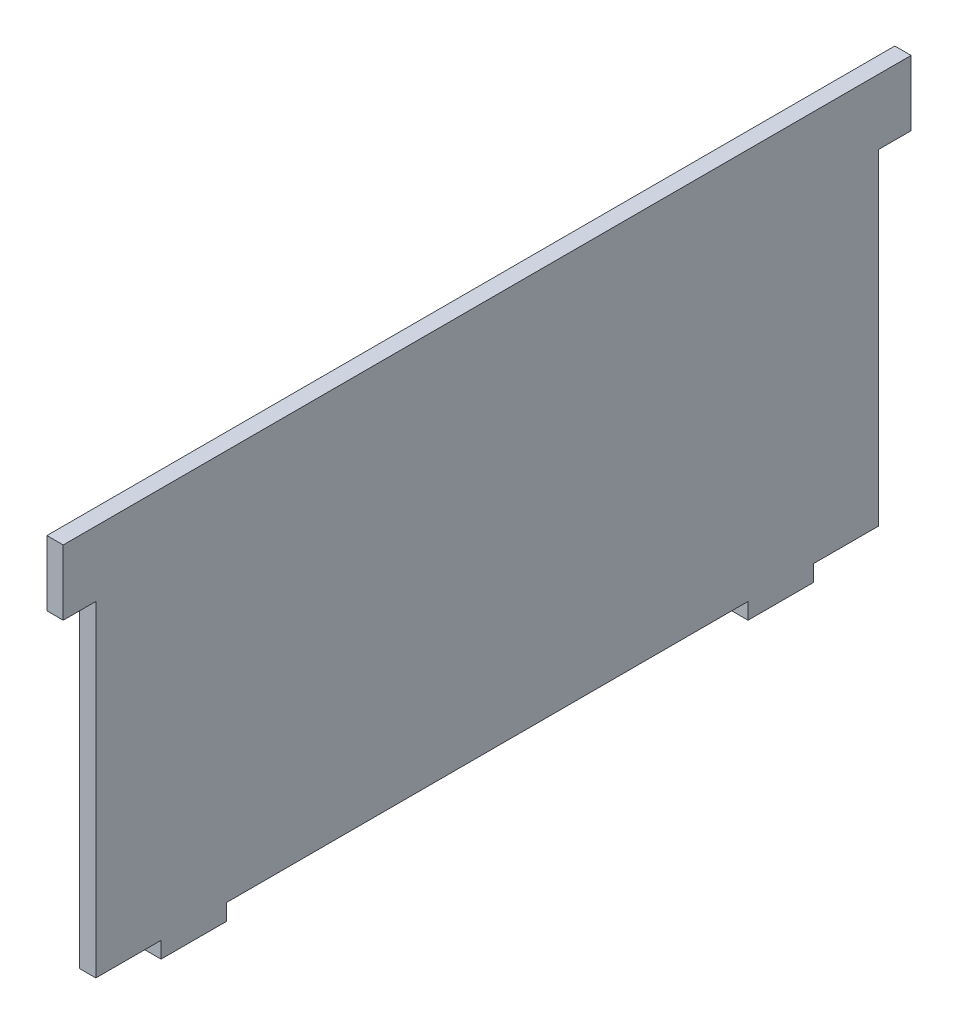
ISO-10303-21;
HEADER;
FILE_DESCRIPTION(('STEP AP214'),'2;1');
FILE_NAME('part.step','',(''),(''),'','','');
FILE_SCHEMA(('AUTOMOTIVE_DESIGN { 1 0 10303 214 1 1 1 1 }'));
ENDSEC;
DATA;
#1=APPLICATION_CONTEXT('core data for automotive mechanical design processes');
#2=APPLICATION_PROTOCOL_DEFINITION('international standard','automotive_design',2000,#1);
#3=PRODUCT_CONTEXT('',#1,'mechanical');
#4=PRODUCT('Part','Part','',(#3));
#5=PRODUCT_RELATED_PRODUCT_CATEGORY('part','',(#4));
#6=PRODUCT_DEFINITION_FORMATION('','',#4);
#7=PRODUCT_DEFINITION_CONTEXT('part definition',#1,'design');
#8=PRODUCT_DEFINITION('design','',#6,#7);
#9=PRODUCT_DEFINITION_SHAPE('','',#8);
#10=(LENGTH_UNIT() NAMED_UNIT(*) SI_UNIT(.MILLI.,.METRE.));
#11=(NAMED_UNIT(*) PLANE_ANGLE_UNIT() SI_UNIT($,.RADIAN.));
#12=(NAMED_UNIT(*) SI_UNIT($,.STERADIAN.) SOLID_ANGLE_UNIT());
#13=UNCERTAINTY_MEASURE_WITH_UNIT(LENGTH_MEASURE(1.E-05),#10,'distance_accuracy_value','');
#14=(GEOMETRIC_REPRESENTATION_CONTEXT(3) GLOBAL_UNCERTAINTY_ASSIGNED_CONTEXT((#13)) GLOBAL_UNIT_ASSIGNED_CONTEXT((#10,
#11,#12)) REPRESENTATION_CONTEXT('',''));
#15=CARTESIAN_POINT('',(0.,0.,0.));
#16=DIRECTION('',(0.,0.,1.));
#17=DIRECTION('',(1.,0.,0.));
#18=AXIS2_PLACEMENT_3D('',#15,#16,#17);
#19=CARTESIAN_POINT('',(5.,0.,-120.));
#20=DIRECTION('',(0.,0.,-1.));
#21=DIRECTION('',(0.,1.,0.));
#22=AXIS2_PLACEMENT_3D('',#19,#20,#21);
#23=PLANE('',#22);
#24=DIRECTION('',(0.,-1.,0.));
#25=VECTOR('',#24,1.);
#26=CARTESIAN_POINT('',(0.,0.,-120.));
#27=LINE('',#26,#25);
#28=CARTESIAN_POINT('',(0.,40.,-120.));
#29=VERTEX_POINT('',#28);
#30=CARTESIAN_POINT('',(0.,-60.,-120.));
#31=VERTEX_POINT('',#30);
#32=EDGE_CURVE('E177',#29,#31,#27,.T.);
#33=ORIENTED_EDGE('',*,*,#32,.F.);
#34=DIRECTION('',(-1.,0.,0.));
#35=VECTOR('',#34,1.);
#36=CARTESIAN_POINT('',(5.,40.,-120.));
#37=LINE('',#36,#35);
#38=CARTESIAN_POINT('',(5.,40.,-120.));
#39=VERTEX_POINT('',#38);
#40=EDGE_CURVE('E11',#39,#29,#37,.T.);
#41=ORIENTED_EDGE('',*,*,#40,.F.);
#42=DIRECTION('',(0.,-1.,0.));
#43=VECTOR('',#42,1.);
#44=CARTESIAN_POINT('',(5.,0.,-120.));
#45=LINE('',#44,#43);
#46=CARTESIAN_POINT('',(5.,-60.,-120.));
#47=VERTEX_POINT('',#46);
#48=EDGE_CURVE('E265',#39,#47,#45,.T.);
#49=ORIENTED_EDGE('',*,*,#48,.T.);
#50=DIRECTION('',(-1.,0.,0.));
#51=VECTOR('',#50,1.);
#52=CARTESIAN_POINT('',(5.,-60.,-120.));
#53=LINE('',#52,#51);
#54=EDGE_CURVE('E108',#47,#31,#53,.T.);
#55=ORIENTED_EDGE('',*,*,#54,.T.);
#56=EDGE_LOOP('',(#33,#41,#49,#55));
#57=FACE_BOUND('',#56,.T.);
#58=ADVANCED_FACE('F34',(#57),#23,.T.);
#59=CARTESIAN_POINT('',(5.,40.,0.));
#60=DIRECTION('',(0.,1.,0.));
#61=DIRECTION('',(0.,0.,1.));
#62=AXIS2_PLACEMENT_3D('',#59,#60,#61);
#63=PLANE('',#62);
#64=DIRECTION('',(0.,0.,-1.));
#65=VECTOR('',#64,1.);
#66=CARTESIAN_POINT('',(0.,40.,0.));
#67=LINE('',#66,#65);
#68=CARTESIAN_POINT('',(0.,40.,-130.));
#69=VERTEX_POINT('',#68);
#70=EDGE_CURVE('E180',#29,#69,#67,.T.);
#71=ORIENTED_EDGE('',*,*,#70,.T.);
#72=DIRECTION('',(-1.,0.,0.));
#73=VECTOR('',#72,1.);
#74=CARTESIAN_POINT('',(5.,40.,-130.));
#75=LINE('',#74,#73);
#76=CARTESIAN_POINT('',(5.,40.,-130.));
#77=VERTEX_POINT('',#76);
#78=EDGE_CURVE('E42',#77,#69,#75,.T.);
#79=ORIENTED_EDGE('',*,*,#78,.F.);
#80=DIRECTION('',(0.,0.,-1.));
#81=VECTOR('',#80,1.);
#82=CARTESIAN_POINT('',(5.,40.,0.));
#83=LINE('',#82,#81);
#84=EDGE_CURVE('E261',#39,#77,#83,.T.);
#85=ORIENTED_EDGE('',*,*,#84,.F.);
#86=ORIENTED_EDGE('',*,*,#40,.T.);
#87=EDGE_LOOP('',(#71,#79,#85,#86));
#88=FACE_BOUND('',#87,.T.);
#89=ADVANCED_FACE('F250',(#88),#63,.F.);
#90=CARTESIAN_POINT('',(5.,0.,-130.));
#91=DIRECTION('',(0.,0.,-1.));
#92=DIRECTION('',(-1.,0.,0.));
#93=AXIS2_PLACEMENT_3D('',#90,#91,#92);
#94=PLANE('',#93);
#95=DIRECTION('',(0.,-1.,0.));
#96=VECTOR('',#95,1.);
#97=CARTESIAN_POINT('',(0.,0.,-130.));
#98=LINE('',#97,#96);
#99=CARTESIAN_POINT('',(0.,60.,-130.));
#100=VERTEX_POINT('',#99);
#101=EDGE_CURVE('E183',#100,#69,#98,.T.);
#102=ORIENTED_EDGE('',*,*,#101,.F.);
#103=DIRECTION('',(-1.,0.,0.));
#104=VECTOR('',#103,1.);
#105=CARTESIAN_POINT('',(5.,60.,-130.));
#106=LINE('',#105,#104);
#107=CARTESIAN_POINT('',(5.,60.,-130.));
#108=VERTEX_POINT('',#107);
#109=EDGE_CURVE('E240',#108,#100,#106,.T.);
#110=ORIENTED_EDGE('',*,*,#109,.F.);
#111=DIRECTION('',(0.,-1.,0.));
#112=VECTOR('',#111,1.);
#113=CARTESIAN_POINT('',(5.,0.,-130.));
#114=LINE('',#113,#112);
#115=EDGE_CURVE('E247',#108,#77,#114,.T.);
#116=ORIENTED_EDGE('',*,*,#115,.T.);
#117=ORIENTED_EDGE('',*,*,#78,.T.);
#118=EDGE_LOOP('',(#102,#110,#116,#117));
#119=FACE_BOUND('',#118,.T.);
#120=ADVANCED_FACE('F245',(#119),#94,.T.);
#121=CARTESIAN_POINT('',(5.,60.,0.));
#122=DIRECTION('',(0.,1.,0.));
#123=DIRECTION('',(0.,0.,1.));
#124=AXIS2_PLACEMENT_3D('',#121,#122,#123);
#125=PLANE('',#124);
#126=DIRECTION('',(0.,0.,-1.));
#127=VECTOR('',#126,1.);
#128=CARTESIAN_POINT('',(0.,60.,0.));
#129=LINE('',#128,#127);
#130=CARTESIAN_POINT('',(0.,60.,130.));
#131=VERTEX_POINT('',#130);
#132=EDGE_CURVE('E186',#131,#100,#129,.T.);
#133=ORIENTED_EDGE('',*,*,#132,.F.);
#134=DIRECTION('',(-1.,0.,0.));
#135=VECTOR('',#134,1.);
#136=CARTESIAN_POINT('',(5.,60.,130.));
#137=LINE('',#136,#135);
#138=CARTESIAN_POINT('',(5.,60.,130.));
#139=VERTEX_POINT('',#138);
#140=EDGE_CURVE('E238',#139,#131,#137,.T.);
#141=ORIENTED_EDGE('',*,*,#140,.F.);
#142=DIRECTION('',(0.,0.,-1.));
#143=VECTOR('',#142,1.);
#144=CARTESIAN_POINT('',(5.,60.,0.));
#145=LINE('',#144,#143);
#146=EDGE_CURVE('E260',#139,#108,#145,.T.);
#147=ORIENTED_EDGE('',*,*,#146,.T.);
#148=ORIENTED_EDGE('',*,*,#109,.T.);
#149=EDGE_LOOP('',(#133,#141,#147,#148));
#150=FACE_BOUND('',#149,.T.);
#151=ADVANCED_FACE('F256',(#150),#125,.T.);
#152=CARTESIAN_POINT('',(5.,0.,130.));
#153=DIRECTION('',(0.,0.,-1.));
#154=DIRECTION('',(-1.,0.,0.));
#155=AXIS2_PLACEMENT_3D('',#152,#153,#154);
#156=PLANE('',#155);
#157=DIRECTION('',(0.,-1.,0.));
#158=VECTOR('',#157,1.);
#159=CARTESIAN_POINT('',(0.,0.,130.));
#160=LINE('',#159,#158);
#161=CARTESIAN_POINT('',(0.,40.,130.));
#162=VERTEX_POINT('',#161);
#163=EDGE_CURVE('E189',#131,#162,#160,.T.);
#164=ORIENTED_EDGE('',*,*,#163,.T.);
#165=DIRECTION('',(-1.,0.,0.));
#166=VECTOR('',#165,1.);
#167=CARTESIAN_POINT('',(5.,40.,130.));
#168=LINE('',#167,#166);
#169=CARTESIAN_POINT('',(5.,40.,130.));
#170=VERTEX_POINT('',#169);
#171=EDGE_CURVE('E236',#170,#162,#168,.T.);
#172=ORIENTED_EDGE('',*,*,#171,.F.);
#173=DIRECTION('',(0.,-1.,0.));
#174=VECTOR('',#173,1.);
#175=CARTESIAN_POINT('',(5.,0.,130.));
#176=LINE('',#175,#174);
#177=EDGE_CURVE('E263',#139,#170,#176,.T.);
#178=ORIENTED_EDGE('',*,*,#177,.F.);
#179=ORIENTED_EDGE('',*,*,#140,.T.);
#180=EDGE_LOOP('',(#164,#172,#178,#179));
#181=FACE_BOUND('',#180,.T.);
#182=ADVANCED_FACE('F303',(#181),#156,.F.);
#183=CARTESIAN_POINT('',(5.,40.,0.));
#184=DIRECTION('',(0.,-1.,0.));
#185=DIRECTION('',(0.,0.,-1.));
#186=AXIS2_PLACEMENT_3D('',#183,#184,#185);
#187=PLANE('',#186);
#188=DIRECTION('',(0.,0.,1.));
#189=VECTOR('',#188,1.);
#190=CARTESIAN_POINT('',(0.,40.,0.));
#191=LINE('',#190,#189);
#192=CARTESIAN_POINT('',(0.,40.,120.));
#193=VERTEX_POINT('',#192);
#194=EDGE_CURVE('E192',#193,#162,#191,.T.);
#195=ORIENTED_EDGE('',*,*,#194,.F.);
#196=DIRECTION('',(-1.,0.,0.));
#197=VECTOR('',#196,1.);
#198=CARTESIAN_POINT('',(5.,40.,120.));
#199=LINE('',#198,#197);
#200=CARTESIAN_POINT('',(5.,40.,120.));
#201=VERTEX_POINT('',#200);
#202=EDGE_CURVE('E234',#201,#193,#199,.T.);
#203=ORIENTED_EDGE('',*,*,#202,.F.);
#204=DIRECTION('',(0.,0.,1.));
#205=VECTOR('',#204,1.);
#206=CARTESIAN_POINT('',(5.,40.,0.));
#207=LINE('',#206,#205);
#208=EDGE_CURVE('E270',#201,#170,#207,.T.);
#209=ORIENTED_EDGE('',*,*,#208,.T.);
#210=ORIENTED_EDGE('',*,*,#171,.T.);
#211=EDGE_LOOP('',(#195,#203,#209,#210));
#212=FACE_BOUND('',#211,.T.);
#213=ADVANCED_FACE('F306',(#212),#187,.T.);
#214=CARTESIAN_POINT('',(5.,0.,120.));
#215=DIRECTION('',(0.,0.,-1.));
#216=DIRECTION('',(0.,1.,0.));
#217=AXIS2_PLACEMENT_3D('',#214,#215,#216);
#218=PLANE('',#217);
#219=DIRECTION('',(0.,-1.,0.));
#220=VECTOR('',#219,1.);
#221=CARTESIAN_POINT('',(0.,0.,120.));
#222=LINE('',#221,#220);
#223=CARTESIAN_POINT('',(0.,-60.,120.));
#224=VERTEX_POINT('',#223);
#225=EDGE_CURVE('E195',#193,#224,#222,.T.);
#226=ORIENTED_EDGE('',*,*,#225,.T.);
#227=DIRECTION('',(-1.,0.,0.));
#228=VECTOR('',#227,1.);
#229=CARTESIAN_POINT('',(5.,-60.,120.));
#230=LINE('',#229,#228);
#231=CARTESIAN_POINT('',(5.,-60.,120.));
#232=VERTEX_POINT('',#231);
#233=EDGE_CURVE('E231',#232,#224,#230,.T.);
#234=ORIENTED_EDGE('',*,*,#233,.F.);
#235=DIRECTION('',(0.,-1.,0.));
#236=VECTOR('',#235,1.);
#237=CARTESIAN_POINT('',(5.,0.,120.));
#238=LINE('',#237,#236);
#239=EDGE_CURVE('E273',#201,#232,#238,.T.);
#240=ORIENTED_EDGE('',*,*,#239,.F.);
#241=ORIENTED_EDGE('',*,*,#202,.T.);
#242=EDGE_LOOP('',(#226,#234,#240,#241));
#243=FACE_BOUND('',#242,.T.);
#244=ADVANCED_FACE('F310',(#243),#218,.F.);
#245=CARTESIAN_POINT('',(5.,-60.,0.));
#246=DIRECTION('',(0.,1.,0.));
#247=DIRECTION('',(0.,0.,1.));
#248=AXIS2_PLACEMENT_3D('',#245,#246,#247);
#249=PLANE('',#248);
#250=DIRECTION('',(0.,0.,-1.));
#251=VECTOR('',#250,1.);
#252=CARTESIAN_POINT('',(0.,-60.,0.));
#253=LINE('',#252,#251);
#254=CARTESIAN_POINT('',(0.,-60.,99.9999999999999));
#255=VERTEX_POINT('',#254);
#256=EDGE_CURVE('E197',#224,#255,#253,.T.);
#257=ORIENTED_EDGE('',*,*,#256,.T.);
#258=DIRECTION('',(-1.,0.,0.));
#259=VECTOR('',#258,1.);
#260=CARTESIAN_POINT('',(5.,-60.,99.9999999999999));
#261=LINE('',#260,#259);
#262=CARTESIAN_POINT('',(5.,-60.,99.9999999999999));
#263=VERTEX_POINT('',#262);
#264=EDGE_CURVE('E228',#263,#255,#261,.T.);
#265=ORIENTED_EDGE('',*,*,#264,.F.);
#266=DIRECTION('',(0.,0.,-1.));
#267=VECTOR('',#266,1.);
#268=CARTESIAN_POINT('',(5.,-60.,0.));
#269=LINE('',#268,#267);
#270=EDGE_CURVE('E174',#232,#263,#269,.T.);
#271=ORIENTED_EDGE('',*,*,#270,.F.);
#272=ORIENTED_EDGE('',*,*,#233,.T.);
#273=EDGE_LOOP('',(#257,#265,#271,#272));
#274=FACE_BOUND('',#273,.T.);
#275=ADVANCED_FACE('F314',(#274),#249,.F.);
#276=CARTESIAN_POINT('',(5.,0.,99.9999999999999));
#277=DIRECTION('',(0.,0.,-1.));
#278=DIRECTION('',(-1.,0.,0.));
#279=AXIS2_PLACEMENT_3D('',#276,#277,#278);
#280=PLANE('',#279);
#281=DIRECTION('',(0.,-1.,0.));
#282=VECTOR('',#281,1.);
#283=CARTESIAN_POINT('',(0.,0.,99.9999999999999));
#284=LINE('',#283,#282);
#285=CARTESIAN_POINT('',(0.,-65.,99.9999999999999));
#286=VERTEX_POINT('',#285);
#287=EDGE_CURVE('E199',#255,#286,#284,.T.);
#288=ORIENTED_EDGE('',*,*,#287,.T.);
#289=DIRECTION('',(-1.,0.,0.));
#290=VECTOR('',#289,1.);
#291=CARTESIAN_POINT('',(5.,-65.,99.9999999999999));
#292=LINE('',#291,#290);
#293=CARTESIAN_POINT('',(5.,-65.,99.9999999999999));
#294=VERTEX_POINT('',#293);
#295=EDGE_CURVE('E226',#294,#286,#292,.T.);
#296=ORIENTED_EDGE('',*,*,#295,.F.);
#297=DIRECTION('',(0.,-1.,0.));
#298=VECTOR('',#297,1.);
#299=CARTESIAN_POINT('',(5.,0.,99.9999999999999));
#300=LINE('',#299,#298);
#301=EDGE_CURVE('E275',#263,#294,#300,.T.);
#302=ORIENTED_EDGE('',*,*,#301,.F.);
#303=ORIENTED_EDGE('',*,*,#264,.T.);
#304=EDGE_LOOP('',(#288,#296,#302,#303));
#305=FACE_BOUND('',#304,.T.);
#306=ADVANCED_FACE('F316',(#305),#280,.F.);
#307=CARTESIAN_POINT('',(5.,-65.,0.));
#308=DIRECTION('',(0.,-1.,0.));
#309=DIRECTION('',(0.,0.,-1.));
#310=AXIS2_PLACEMENT_3D('',#307,#308,#309);
#311=PLANE('',#310);
#312=DIRECTION('',(0.,0.,1.));
#313=VECTOR('',#312,1.);
#314=CARTESIAN_POINT('',(0.,-65.,0.));
#315=LINE('',#314,#313);
#316=CARTESIAN_POINT('',(0.,-65.,79.9999999999999));
#317=VERTEX_POINT('',#316);
#318=EDGE_CURVE('E204',#317,#286,#315,.T.);
#319=ORIENTED_EDGE('',*,*,#318,.F.);
#320=DIRECTION('',(-1.,0.,0.));
#321=VECTOR('',#320,1.);
#322=CARTESIAN_POINT('',(5.,-65.,79.9999999999999));
#323=LINE('',#322,#321);
#324=CARTESIAN_POINT('',(5.,-65.,79.9999999999999));
#325=VERTEX_POINT('',#324);
#326=EDGE_CURVE('E224',#325,#317,#323,.T.);
#327=ORIENTED_EDGE('',*,*,#326,.F.);
#328=DIRECTION('',(0.,0.,1.));
#329=VECTOR('',#328,1.);
#330=CARTESIAN_POINT('',(5.,-65.,0.));
#331=LINE('',#330,#329);
#332=EDGE_CURVE('E277',#325,#294,#331,.T.);
#333=ORIENTED_EDGE('',*,*,#332,.T.);
#334=ORIENTED_EDGE('',*,*,#295,.T.);
#335=EDGE_LOOP('',(#319,#327,#333,#334));
#336=FACE_BOUND('',#335,.T.);
#337=ADVANCED_FACE('F319',(#336),#311,.T.);
#338=CARTESIAN_POINT('',(5.,0.,79.9999999999999));
#339=DIRECTION('',(0.,0.,-1.));
#340=DIRECTION('',(-1.,0.,0.));
#341=AXIS2_PLACEMENT_3D('',#338,#339,#340);
#342=PLANE('',#341);
#343=DIRECTION('',(0.,-1.,0.));
#344=VECTOR('',#343,1.);
#345=CARTESIAN_POINT('',(0.,0.,79.9999999999999));
#346=LINE('',#345,#344);
#347=CARTESIAN_POINT('',(0.,-60.,79.9999999999999));
#348=VERTEX_POINT('',#347);
#349=EDGE_CURVE('E207',#348,#317,#346,.T.);
#350=ORIENTED_EDGE('',*,*,#349,.F.);
#351=DIRECTION('',(-1.,0.,0.));
#352=VECTOR('',#351,1.);
#353=CARTESIAN_POINT('',(5.,-60.,79.9999999999999));
#354=LINE('',#353,#352);
#355=CARTESIAN_POINT('',(5.,-60.,79.9999999999999));
#356=VERTEX_POINT('',#355);
#357=EDGE_CURVE('E222',#356,#348,#354,.T.);
#358=ORIENTED_EDGE('',*,*,#357,.F.);
#359=DIRECTION('',(0.,-1.,0.));
#360=VECTOR('',#359,1.);
#361=CARTESIAN_POINT('',(5.,0.,79.9999999999999));
#362=LINE('',#361,#360);
#363=EDGE_CURVE('E280',#356,#325,#362,.T.);
#364=ORIENTED_EDGE('',*,*,#363,.T.);
#365=ORIENTED_EDGE('',*,*,#326,.T.);
#366=EDGE_LOOP('',(#350,#358,#364,#365));
#367=FACE_BOUND('',#366,.T.);
#368=ADVANCED_FACE('F323',(#367),#342,.T.);
#369=CARTESIAN_POINT('',(0.,-60.,-80.0000000000001));
#370=VERTEX_POINT('',#369);
#371=EDGE_CURVE('E201',#348,#370,#253,.T.);
#372=ORIENTED_EDGE('',*,*,#371,.T.);
#373=DIRECTION('',(-1.,0.,0.));
#374=VECTOR('',#373,1.);
#375=CARTESIAN_POINT('',(5.,-60.,-80.0000000000001));
#376=LINE('',#375,#374);
#377=CARTESIAN_POINT('',(5.,-60.,-80.0000000000001));
#378=VERTEX_POINT('',#377);
#379=EDGE_CURVE('E219',#378,#370,#376,.T.);
#380=ORIENTED_EDGE('',*,*,#379,.F.);
#381=EDGE_CURVE('E173',#356,#378,#269,.T.);
#382=ORIENTED_EDGE('',*,*,#381,.F.);
#383=ORIENTED_EDGE('',*,*,#357,.T.);
#384=EDGE_LOOP('',(#372,#380,#382,#383));
#385=FACE_BOUND('',#384,.T.);
#386=ADVANCED_FACE('F287',(#385),#249,.F.);
#387=CARTESIAN_POINT('',(5.,0.,-80.0000000000001));
#388=DIRECTION('',(0.,0.,-1.));
#389=DIRECTION('',(-1.,0.,0.));
#390=AXIS2_PLACEMENT_3D('',#387,#388,#389);
#391=PLANE('',#390);
#392=DIRECTION('',(0.,-1.,0.));
#393=VECTOR('',#392,1.);
#394=CARTESIAN_POINT('',(0.,0.,-80.0000000000001));
#395=LINE('',#394,#393);
#396=CARTESIAN_POINT('',(0.,-65.,-80.0000000000001));
#397=VERTEX_POINT('',#396);
#398=EDGE_CURVE('E210',#370,#397,#395,.T.);
#399=ORIENTED_EDGE('',*,*,#398,.T.);
#400=DIRECTION('',(-1.,0.,0.));
#401=VECTOR('',#400,1.);
#402=CARTESIAN_POINT('',(5.,-65.,-80.0000000000001));
#403=LINE('',#402,#401);
#404=CARTESIAN_POINT('',(5.,-65.,-80.0000000000001));
#405=VERTEX_POINT('',#404);
#406=EDGE_CURVE('E162',#405,#397,#403,.T.);
#407=ORIENTED_EDGE('',*,*,#406,.F.);
#408=DIRECTION('',(0.,-1.,0.));
#409=VECTOR('',#408,1.);
#410=CARTESIAN_POINT('',(5.,0.,-80.0000000000001));
#411=LINE('',#410,#409);
#412=EDGE_CURVE('E167',#378,#405,#411,.T.);
#413=ORIENTED_EDGE('',*,*,#412,.F.);
#414=ORIENTED_EDGE('',*,*,#379,.T.);
#415=EDGE_LOOP('',(#399,#407,#413,#414));
#416=FACE_BOUND('',#415,.T.);
#417=ADVANCED_FACE('F291',(#416),#391,.F.);
#418=CARTESIAN_POINT('',(5.,-65.,0.));
#419=DIRECTION('',(0.,-1.,0.));
#420=DIRECTION('',(0.,0.,-1.));
#421=AXIS2_PLACEMENT_3D('',#418,#419,#420);
#422=PLANE('',#421);
#423=DIRECTION('',(0.,0.,1.));
#424=VECTOR('',#423,1.);
#425=CARTESIAN_POINT('',(0.,-65.,0.));
#426=LINE('',#425,#424);
#427=CARTESIAN_POINT('',(0.,-65.,-100.));
#428=VERTEX_POINT('',#427);
#429=EDGE_CURVE('E157',#428,#397,#426,.T.);
#430=ORIENTED_EDGE('',*,*,#429,.F.);
#431=DIRECTION('',(-1.,0.,0.));
#432=VECTOR('',#431,1.);
#433=CARTESIAN_POINT('',(5.,-65.,-100.));
#434=LINE('',#433,#432);
#435=CARTESIAN_POINT('',(5.,-65.,-100.));
#436=VERTEX_POINT('',#435);
#437=EDGE_CURVE('E152',#436,#428,#434,.T.);
#438=ORIENTED_EDGE('',*,*,#437,.F.);
#439=DIRECTION('',(0.,0.,1.));
#440=VECTOR('',#439,1.);
#441=CARTESIAN_POINT('',(5.,-65.,0.));
#442=LINE('',#441,#440);
#443=EDGE_CURVE('E155',#436,#405,#442,.T.);
#444=ORIENTED_EDGE('',*,*,#443,.T.);
#445=ORIENTED_EDGE('',*,*,#406,.T.);
#446=EDGE_LOOP('',(#430,#438,#444,#445));
#447=FACE_BOUND('',#446,.T.);
#448=ADVANCED_FACE('F154',(#447),#422,.T.);
#449=CARTESIAN_POINT('',(5.,0.,-100.));
#450=DIRECTION('',(0.,0.,-1.));
#451=DIRECTION('',(-1.,0.,0.));
#452=AXIS2_PLACEMENT_3D('',#449,#450,#451);
#453=PLANE('',#452);
#454=DIRECTION('',(0.,-1.,0.));
#455=VECTOR('',#454,1.);
#456=CARTESIAN_POINT('',(0.,0.,-100.));
#457=LINE('',#456,#455);
#458=CARTESIAN_POINT('',(0.,-60.,-100.));
#459=VERTEX_POINT('',#458);
#460=EDGE_CURVE('E214',#459,#428,#457,.T.);
#461=ORIENTED_EDGE('',*,*,#460,.F.);
#462=DIRECTION('',(-1.,0.,0.));
#463=VECTOR('',#462,1.);
#464=CARTESIAN_POINT('',(5.,-60.,-100.));
#465=LINE('',#464,#463);
#466=CARTESIAN_POINT('',(5.,-60.,-100.));
#467=VERTEX_POINT('',#466);
#468=EDGE_CURVE('E101',#467,#459,#465,.T.);
#469=ORIENTED_EDGE('',*,*,#468,.F.);
#470=DIRECTION('',(0.,-1.,0.));
#471=VECTOR('',#470,1.);
#472=CARTESIAN_POINT('',(5.,0.,-100.));
#473=LINE('',#472,#471);
#474=EDGE_CURVE('E165',#467,#436,#473,.T.);
#475=ORIENTED_EDGE('',*,*,#474,.T.);
#476=ORIENTED_EDGE('',*,*,#437,.T.);
#477=EDGE_LOOP('',(#461,#469,#475,#476));
#478=FACE_BOUND('',#477,.T.);
#479=ADVANCED_FACE('F170',(#478),#453,.T.);
#480=EDGE_CURVE('E200',#459,#31,#253,.T.);
#481=ORIENTED_EDGE('',*,*,#480,.T.);
#482=ORIENTED_EDGE('',*,*,#54,.F.);
#483=EDGE_CURVE('E50',#467,#47,#269,.T.);
#484=ORIENTED_EDGE('',*,*,#483,.F.);
#485=ORIENTED_EDGE('',*,*,#468,.T.);
#486=EDGE_LOOP('',(#481,#482,#484,#485));
#487=FACE_BOUND('',#486,.T.);
#488=ADVANCED_FACE('F334',(#487),#249,.F.);
#489=CARTESIAN_POINT('',(5.,0.,0.));
#490=DIRECTION('',(1.,0.,0.));
#491=DIRECTION('',(0.,0.,-1.));
#492=AXIS2_PLACEMENT_3D('',#489,#490,#491);
#493=PLANE('',#492);
#494=ORIENTED_EDGE('',*,*,#48,.F.);
#495=ORIENTED_EDGE('',*,*,#84,.T.);
#496=ORIENTED_EDGE('',*,*,#115,.F.);
#497=ORIENTED_EDGE('',*,*,#146,.F.);
#498=ORIENTED_EDGE('',*,*,#177,.T.);
#499=ORIENTED_EDGE('',*,*,#208,.F.);
#500=ORIENTED_EDGE('',*,*,#239,.T.);
#501=ORIENTED_EDGE('',*,*,#270,.T.);
#502=ORIENTED_EDGE('',*,*,#301,.T.);
#503=ORIENTED_EDGE('',*,*,#332,.F.);
#504=ORIENTED_EDGE('',*,*,#363,.F.);
#505=ORIENTED_EDGE('',*,*,#381,.T.);
#506=ORIENTED_EDGE('',*,*,#412,.T.);
#507=ORIENTED_EDGE('',*,*,#443,.F.);
#508=ORIENTED_EDGE('',*,*,#474,.F.);
#509=ORIENTED_EDGE('',*,*,#483,.T.);
#510=EDGE_LOOP('',(#494,#495,#496,#497,#498,#499,#500,#501,#502,#503,#504,#505,#506,#507,#508,#509));
#511=FACE_BOUND('',#510,.T.);
#512=ADVANCED_FACE('F164',(#511),#493,.T.);
#513=CARTESIAN_POINT('',(0.,0.,0.));
#514=DIRECTION('',(1.,0.,0.));
#515=DIRECTION('',(0.,0.,-1.));
#516=AXIS2_PLACEMENT_3D('',#513,#514,#515);
#517=PLANE('',#516);
#518=ORIENTED_EDGE('',*,*,#32,.T.);
#519=ORIENTED_EDGE('',*,*,#480,.F.);
#520=ORIENTED_EDGE('',*,*,#460,.T.);
#521=ORIENTED_EDGE('',*,*,#429,.T.);
#522=ORIENTED_EDGE('',*,*,#398,.F.);
#523=ORIENTED_EDGE('',*,*,#371,.F.);
#524=ORIENTED_EDGE('',*,*,#349,.T.);
#525=ORIENTED_EDGE('',*,*,#318,.T.);
#526=ORIENTED_EDGE('',*,*,#287,.F.);
#527=ORIENTED_EDGE('',*,*,#256,.F.);
#528=ORIENTED_EDGE('',*,*,#225,.F.);
#529=ORIENTED_EDGE('',*,*,#194,.T.);
#530=ORIENTED_EDGE('',*,*,#163,.F.);
#531=ORIENTED_EDGE('',*,*,#132,.T.);
#532=ORIENTED_EDGE('',*,*,#101,.T.);
#533=ORIENTED_EDGE('',*,*,#70,.F.);
#534=EDGE_LOOP('',(#518,#519,#520,#521,#522,#523,#524,#525,#526,#527,#528,#529,#530,#531,#532,#533));
#535=FACE_BOUND('',#534,.T.);
#536=ADVANCED_FACE('F252',(#535),#517,.F.);
#537=CLOSED_SHELL('',(#58,#89,#120,#151,#182,#213,#244,#275,#306,#337,#368,#386,#417,#448,#479,
#488,#512,#536));
#538=MANIFOLD_SOLID_BREP('B2',#537);
#539=ADVANCED_BREP_SHAPE_REPRESENTATION('',(#18,#538),#14);
#540=SHAPE_DEFINITION_REPRESENTATION(#9,#539);
ENDSEC;
END-ISO-10303-21;
